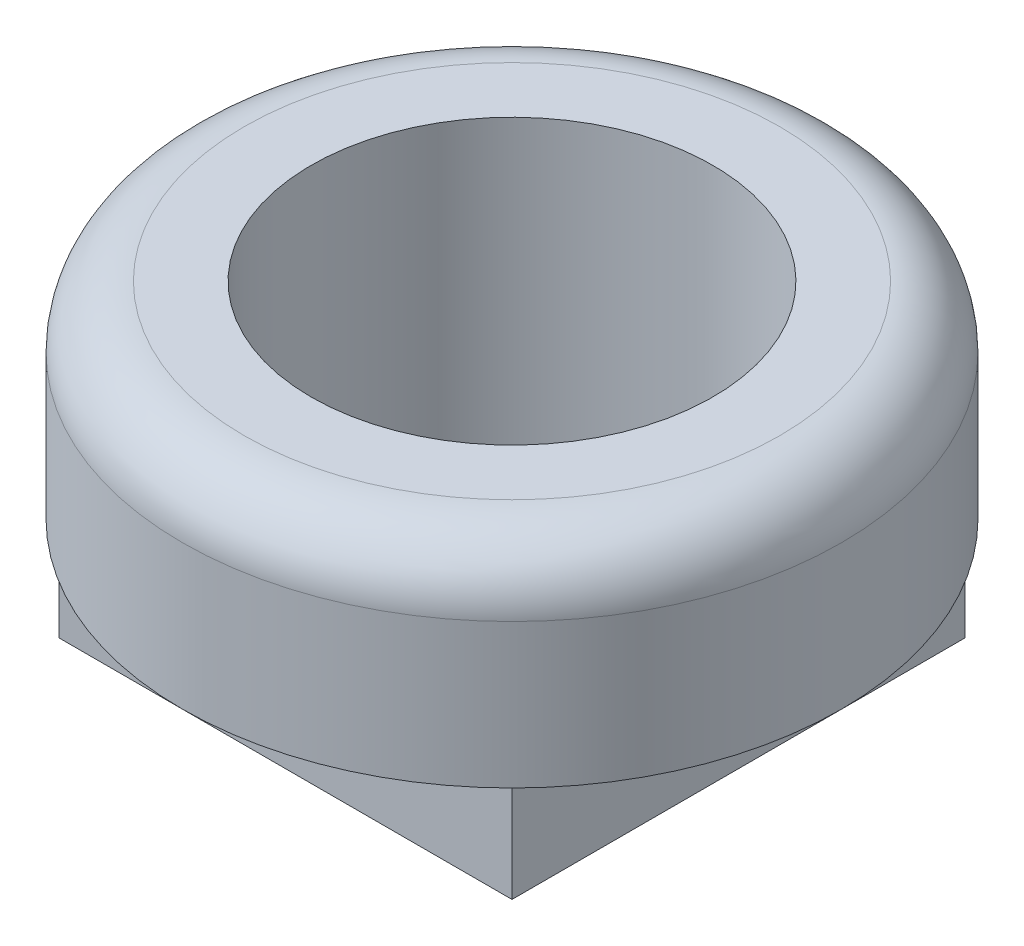
ISO-10303-21;
HEADER;
FILE_DESCRIPTION(('STEP AP214'),'2;1');
FILE_NAME('part.step','',(''),(''),'','','');
FILE_SCHEMA(('AUTOMOTIVE_DESIGN { 1 0 10303 214 1 1 1 1 }'));
ENDSEC;
DATA;
#1=APPLICATION_CONTEXT('core data for automotive mechanical design processes');
#2=APPLICATION_PROTOCOL_DEFINITION('international standard','automotive_design',2000,#1);
#3=PRODUCT_CONTEXT('',#1,'mechanical');
#4=PRODUCT('Part','Part','',(#3));
#5=PRODUCT_RELATED_PRODUCT_CATEGORY('part','',(#4));
#6=PRODUCT_DEFINITION_FORMATION('','',#4);
#7=PRODUCT_DEFINITION_CONTEXT('part definition',#1,'design');
#8=PRODUCT_DEFINITION('design','',#6,#7);
#9=PRODUCT_DEFINITION_SHAPE('','',#8);
#10=(LENGTH_UNIT() NAMED_UNIT(*) SI_UNIT(.MILLI.,.METRE.));
#11=(NAMED_UNIT(*) PLANE_ANGLE_UNIT() SI_UNIT($,.RADIAN.));
#12=(NAMED_UNIT(*) SI_UNIT($,.STERADIAN.) SOLID_ANGLE_UNIT());
#13=UNCERTAINTY_MEASURE_WITH_UNIT(LENGTH_MEASURE(1.E-05),#10,'distance_accuracy_value','');
#14=(GEOMETRIC_REPRESENTATION_CONTEXT(3) GLOBAL_UNCERTAINTY_ASSIGNED_CONTEXT((#13)) GLOBAL_UNIT_ASSIGNED_CONTEXT((#10,
#11,#12)) REPRESENTATION_CONTEXT('',''));
#15=CARTESIAN_POINT('',(0.,0.,0.));
#16=DIRECTION('',(0.,0.,1.));
#17=DIRECTION('',(1.,0.,0.));
#18=AXIS2_PLACEMENT_3D('',#15,#16,#17);
#19=CARTESIAN_POINT('',(0.,0.,0.));
#20=DIRECTION('',(0.,1.,0.));
#21=DIRECTION('',(0.,0.,1.));
#22=AXIS2_PLACEMENT_3D('',#19,#20,#21);
#23=PLANE('',#22);
#24=CARTESIAN_POINT('',(0.,0.,0.));
#25=DIRECTION('',(0.,1.,0.));
#26=DIRECTION('',(0.,0.,1.));
#27=AXIS2_PLACEMENT_3D('',#24,#25,#26);
#28=CIRCLE('',#27,16.);
#29=CARTESIAN_POINT('',(0.,0.,16.));
#30=VERTEX_POINT('',#29);
#31=EDGE_CURVE('E100',#30,#30,#28,.T.);
#32=ORIENTED_EDGE('',*,*,#31,.F.);
#33=EDGE_LOOP('',(#32));
#34=FACE_BOUND('',#33,.T.);
#35=DIRECTION('',(0.,0.,-1.));
#36=VECTOR('',#35,1.);
#37=CARTESIAN_POINT('',(-11.,0.,11.));
#38=LINE('',#37,#36);
#39=CARTESIAN_POINT('',(-11.,0.,11.));
#40=VERTEX_POINT('',#39);
#41=CARTESIAN_POINT('',(-11.,0.,-11.));
#42=VERTEX_POINT('',#41);
#43=EDGE_CURVE('E54',#40,#42,#38,.T.);
#44=ORIENTED_EDGE('',*,*,#43,.F.);
#45=DIRECTION('',(-1.,0.,0.));
#46=VECTOR('',#45,1.);
#47=CARTESIAN_POINT('',(11.,0.,11.));
#48=LINE('',#47,#46);
#49=CARTESIAN_POINT('',(11.,0.,11.));
#50=VERTEX_POINT('',#49);
#51=EDGE_CURVE('E58',#50,#40,#48,.T.);
#52=ORIENTED_EDGE('',*,*,#51,.F.);
#53=DIRECTION('',(0.,0.,1.));
#54=VECTOR('',#53,1.);
#55=CARTESIAN_POINT('',(11.,0.,11.));
#56=LINE('',#55,#54);
#57=CARTESIAN_POINT('',(11.,0.,-11.));
#58=VERTEX_POINT('',#57);
#59=EDGE_CURVE('E164',#58,#50,#56,.T.);
#60=ORIENTED_EDGE('',*,*,#59,.F.);
#61=DIRECTION('',(1.,0.,0.));
#62=VECTOR('',#61,1.);
#63=CARTESIAN_POINT('',(11.,0.,-11.));
#64=LINE('',#63,#62);
#65=EDGE_CURVE('E155',#42,#58,#64,.T.);
#66=ORIENTED_EDGE('',*,*,#65,.F.);
#67=EDGE_LOOP('',(#44,#52,#60,#66));
#68=FACE_BOUND('',#67,.T.);
#69=ADVANCED_FACE('F39',(#34,#68),#23,.F.);
#70=CARTESIAN_POINT('',(0.,10.,0.));
#71=DIRECTION('',(0.,-1.,0.));
#72=DIRECTION('',(0.,0.,-1.));
#73=AXIS2_PLACEMENT_3D('',#70,#71,#72);
#74=CYLINDRICAL_SURFACE('',#73,16.);
#75=CARTESIAN_POINT('',(0.,7.,0.));
#76=DIRECTION('',(0.,1.,0.));
#77=DIRECTION('',(0.,0.,1.));
#78=AXIS2_PLACEMENT_3D('',#75,#76,#77);
#79=CIRCLE('',#78,16.);
#80=CARTESIAN_POINT('',(0.,7.,16.));
#81=VERTEX_POINT('',#80);
#82=EDGE_CURVE('E11',#81,#81,#79,.F.);
#83=ORIENTED_EDGE('',*,*,#82,.T.);
#84=EDGE_LOOP('',(#83));
#85=FACE_BOUND('',#84,.T.);
#86=ORIENTED_EDGE('',*,*,#31,.T.);
#87=EDGE_LOOP('',(#86));
#88=FACE_BOUND('',#87,.T.);
#89=ADVANCED_FACE('F124',(#85,#88),#74,.T.);
#90=CARTESIAN_POINT('',(0.,10.,0.));
#91=DIRECTION('',(0.,1.,0.));
#92=DIRECTION('',(0.,0.,1.));
#93=AXIS2_PLACEMENT_3D('',#90,#91,#92);
#94=PLANE('',#93);
#95=CARTESIAN_POINT('',(0.,10.,0.));
#96=DIRECTION('',(0.,1.,0.));
#97=DIRECTION('',(0.,0.,1.));
#98=AXIS2_PLACEMENT_3D('',#95,#96,#97);
#99=CIRCLE('',#98,13.);
#100=CARTESIAN_POINT('',(0.,10.,13.));
#101=VERTEX_POINT('',#100);
#102=EDGE_CURVE('E47',#101,#101,#99,.T.);
#103=ORIENTED_EDGE('',*,*,#102,.T.);
#104=EDGE_LOOP('',(#103));
#105=FACE_BOUND('',#104,.T.);
#106=CARTESIAN_POINT('',(0.,10.,0.));
#107=DIRECTION('',(0.,1.,0.));
#108=DIRECTION('',(0.,0.,1.));
#109=AXIS2_PLACEMENT_3D('',#106,#107,#108);
#110=CIRCLE('',#109,9.75);
#111=CARTESIAN_POINT('',(0.,10.,9.75));
#112=VERTEX_POINT('',#111);
#113=EDGE_CURVE('E153',#112,#112,#110,.T.);
#114=ORIENTED_EDGE('',*,*,#113,.F.);
#115=EDGE_LOOP('',(#114));
#116=FACE_BOUND('',#115,.T.);
#117=ADVANCED_FACE('F110',(#105,#116),#94,.T.);
#118=CARTESIAN_POINT('',(-11.,-5.,11.));
#119=DIRECTION('',(1.,0.,0.));
#120=DIRECTION('',(0.,0.,-1.));
#121=AXIS2_PLACEMENT_3D('',#118,#119,#120);
#122=PLANE('',#121);
#123=ORIENTED_EDGE('',*,*,#43,.T.);
#124=DIRECTION('',(0.,1.,0.));
#125=VECTOR('',#124,1.);
#126=CARTESIAN_POINT('',(-11.,-5.,-11.));
#127=LINE('',#126,#125);
#128=CARTESIAN_POINT('',(-11.,-5.,-11.));
#129=VERTEX_POINT('',#128);
#130=EDGE_CURVE('E83',#129,#42,#127,.T.);
#131=ORIENTED_EDGE('',*,*,#130,.F.);
#132=DIRECTION('',(0.,0.,-1.));
#133=VECTOR('',#132,1.);
#134=CARTESIAN_POINT('',(-11.,-5.,11.));
#135=LINE('',#134,#133);
#136=CARTESIAN_POINT('',(-11.,-5.,11.));
#137=VERTEX_POINT('',#136);
#138=EDGE_CURVE('E89',#137,#129,#135,.T.);
#139=ORIENTED_EDGE('',*,*,#138,.F.);
#140=DIRECTION('',(0.,1.,0.));
#141=VECTOR('',#140,1.);
#142=CARTESIAN_POINT('',(-11.,-5.,11.));
#143=LINE('',#142,#141);
#144=EDGE_CURVE('E161',#137,#40,#143,.T.);
#145=ORIENTED_EDGE('',*,*,#144,.T.);
#146=EDGE_LOOP('',(#123,#131,#139,#145));
#147=FACE_BOUND('',#146,.T.);
#148=ADVANCED_FACE('F99',(#147),#122,.F.);
#149=CARTESIAN_POINT('',(11.,-5.,-11.));
#150=DIRECTION('',(0.,0.,1.));
#151=DIRECTION('',(1.,0.,0.));
#152=AXIS2_PLACEMENT_3D('',#149,#150,#151);
#153=PLANE('',#152);
#154=ORIENTED_EDGE('',*,*,#65,.T.);
#155=DIRECTION('',(0.,1.,0.));
#156=VECTOR('',#155,1.);
#157=CARTESIAN_POINT('',(11.,-5.,-11.));
#158=LINE('',#157,#156);
#159=CARTESIAN_POINT('',(11.,-5.,-11.));
#160=VERTEX_POINT('',#159);
#161=EDGE_CURVE('E85',#160,#58,#158,.T.);
#162=ORIENTED_EDGE('',*,*,#161,.F.);
#163=DIRECTION('',(1.,0.,0.));
#164=VECTOR('',#163,1.);
#165=CARTESIAN_POINT('',(11.,-5.,-11.));
#166=LINE('',#165,#164);
#167=EDGE_CURVE('E78',#129,#160,#166,.T.);
#168=ORIENTED_EDGE('',*,*,#167,.F.);
#169=ORIENTED_EDGE('',*,*,#130,.T.);
#170=EDGE_LOOP('',(#154,#162,#168,#169));
#171=FACE_BOUND('',#170,.T.);
#172=ADVANCED_FACE('F81',(#171),#153,.F.);
#173=CARTESIAN_POINT('',(11.,-5.,11.));
#174=DIRECTION('',(-1.,0.,0.));
#175=DIRECTION('',(0.,0.,1.));
#176=AXIS2_PLACEMENT_3D('',#173,#174,#175);
#177=PLANE('',#176);
#178=ORIENTED_EDGE('',*,*,#59,.T.);
#179=DIRECTION('',(0.,1.,0.));
#180=VECTOR('',#179,1.);
#181=CARTESIAN_POINT('',(11.,-5.,11.));
#182=LINE('',#181,#180);
#183=CARTESIAN_POINT('',(11.,-5.,11.));
#184=VERTEX_POINT('',#183);
#185=EDGE_CURVE('E104',#184,#50,#182,.T.);
#186=ORIENTED_EDGE('',*,*,#185,.F.);
#187=DIRECTION('',(0.,0.,1.));
#188=VECTOR('',#187,1.);
#189=CARTESIAN_POINT('',(11.,-5.,11.));
#190=LINE('',#189,#188);
#191=EDGE_CURVE('E88',#160,#184,#190,.T.);
#192=ORIENTED_EDGE('',*,*,#191,.F.);
#193=ORIENTED_EDGE('',*,*,#161,.T.);
#194=EDGE_LOOP('',(#178,#186,#192,#193));
#195=FACE_BOUND('',#194,.T.);
#196=ADVANCED_FACE('F138',(#195),#177,.F.);
#197=CARTESIAN_POINT('',(11.,-5.,11.));
#198=DIRECTION('',(0.,0.,-1.));
#199=DIRECTION('',(-1.,0.,0.));
#200=AXIS2_PLACEMENT_3D('',#197,#198,#199);
#201=PLANE('',#200);
#202=ORIENTED_EDGE('',*,*,#51,.T.);
#203=ORIENTED_EDGE('',*,*,#144,.F.);
#204=DIRECTION('',(-1.,0.,0.));
#205=VECTOR('',#204,1.);
#206=CARTESIAN_POINT('',(11.,-5.,11.));
#207=LINE('',#206,#205);
#208=EDGE_CURVE('E94',#184,#137,#207,.T.);
#209=ORIENTED_EDGE('',*,*,#208,.F.);
#210=ORIENTED_EDGE('',*,*,#185,.T.);
#211=EDGE_LOOP('',(#202,#203,#209,#210));
#212=FACE_BOUND('',#211,.T.);
#213=ADVANCED_FACE('F141',(#212),#201,.F.);
#214=CARTESIAN_POINT('',(0.,-5.,0.));
#215=DIRECTION('',(0.,1.,0.));
#216=DIRECTION('',(0.,0.,1.));
#217=AXIS2_PLACEMENT_3D('',#214,#215,#216);
#218=PLANE('',#217);
#219=CARTESIAN_POINT('',(0.,-5.,0.));
#220=DIRECTION('',(0.,1.,0.));
#221=DIRECTION('',(0.,0.,1.));
#222=AXIS2_PLACEMENT_3D('',#219,#220,#221);
#223=CIRCLE('',#222,9.75);
#224=CARTESIAN_POINT('',(0.,-5.,9.75));
#225=VERTEX_POINT('',#224);
#226=EDGE_CURVE('E152',#225,#225,#223,.T.);
#227=ORIENTED_EDGE('',*,*,#226,.T.);
#228=EDGE_LOOP('',(#227));
#229=FACE_BOUND('',#228,.T.);
#230=ORIENTED_EDGE('',*,*,#138,.T.);
#231=ORIENTED_EDGE('',*,*,#167,.T.);
#232=ORIENTED_EDGE('',*,*,#191,.T.);
#233=ORIENTED_EDGE('',*,*,#208,.T.);
#234=EDGE_LOOP('',(#230,#231,#232,#233));
#235=FACE_BOUND('',#234,.T.);
#236=ADVANCED_FACE('F92',(#229,#235),#218,.F.);
#237=CARTESIAN_POINT('',(0.,-5.,0.));
#238=DIRECTION('',(0.,1.,0.));
#239=DIRECTION('',(0.,0.,1.));
#240=AXIS2_PLACEMENT_3D('',#237,#238,#239);
#241=CYLINDRICAL_SURFACE('',#240,9.75);
#242=ORIENTED_EDGE('',*,*,#226,.F.);
#243=EDGE_LOOP('',(#242));
#244=FACE_BOUND('',#243,.T.);
#245=ORIENTED_EDGE('',*,*,#113,.T.);
#246=EDGE_LOOP('',(#245));
#247=FACE_BOUND('',#246,.T.);
#248=ADVANCED_FACE('F114',(#244,#247),#241,.F.);
#249=CARTESIAN_POINT('',(0.,7.,0.));
#250=DIRECTION('',(0.,1.,0.));
#251=DIRECTION('',(0.,0.,1.));
#252=AXIS2_PLACEMENT_3D('',#249,#250,#251);
#253=TOROIDAL_SURFACE('',#252,13.,3.);
#254=ORIENTED_EDGE('',*,*,#82,.F.);
#255=EDGE_LOOP('',(#254));
#256=FACE_BOUND('',#255,.T.);
#257=ORIENTED_EDGE('',*,*,#102,.F.);
#258=EDGE_LOOP('',(#257));
#259=FACE_BOUND('',#258,.T.);
#260=ADVANCED_FACE('F41',(#256,#259),#253,.T.);
#261=CLOSED_SHELL('',(#69,#89,#117,#148,#172,#196,#213,#236,#248,#260));
#262=MANIFOLD_SOLID_BREP('B2',#261);
#263=ADVANCED_BREP_SHAPE_REPRESENTATION('',(#18,#262),#14);
#264=SHAPE_DEFINITION_REPRESENTATION(#9,#263);
ENDSEC;
END-ISO-10303-21;
